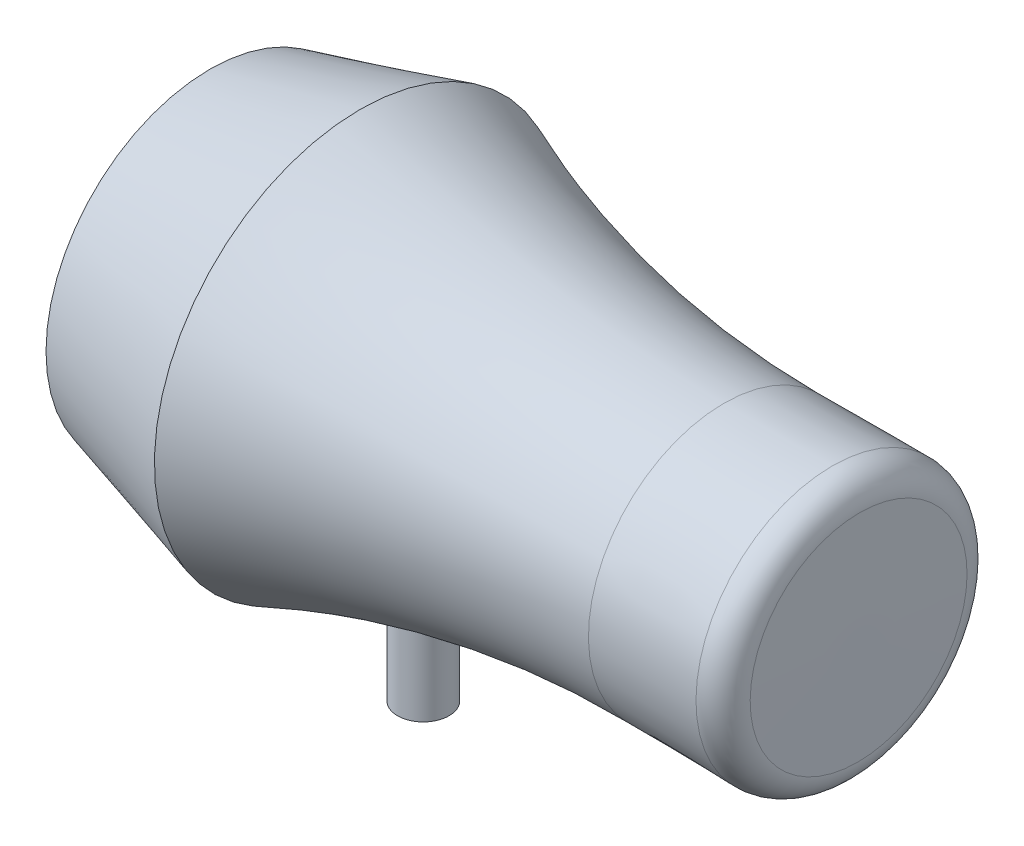
ISO-10303-21;
HEADER;
FILE_DESCRIPTION(('STEP AP214'),'2;1');
FILE_NAME('part.step','',(''),(''),'','','');
FILE_SCHEMA(('AUTOMOTIVE_DESIGN { 1 0 10303 214 1 1 1 1 }'));
ENDSEC;
DATA;
#1=APPLICATION_CONTEXT('core data for automotive mechanical design processes');
#2=APPLICATION_PROTOCOL_DEFINITION('international standard','automotive_design',2000,#1);
#3=PRODUCT_CONTEXT('',#1,'mechanical');
#4=PRODUCT('Part','Part','',(#3));
#5=PRODUCT_RELATED_PRODUCT_CATEGORY('part','',(#4));
#6=PRODUCT_DEFINITION_FORMATION('','',#4);
#7=PRODUCT_DEFINITION_CONTEXT('part definition',#1,'design');
#8=PRODUCT_DEFINITION('design','',#6,#7);
#9=PRODUCT_DEFINITION_SHAPE('','',#8);
#10=(LENGTH_UNIT() NAMED_UNIT(*) SI_UNIT(.MILLI.,.METRE.));
#11=(NAMED_UNIT(*) PLANE_ANGLE_UNIT() SI_UNIT($,.RADIAN.));
#12=(NAMED_UNIT(*) SI_UNIT($,.STERADIAN.) SOLID_ANGLE_UNIT());
#13=UNCERTAINTY_MEASURE_WITH_UNIT(LENGTH_MEASURE(1.E-05),#10,'distance_accuracy_value','');
#14=(GEOMETRIC_REPRESENTATION_CONTEXT(3) GLOBAL_UNCERTAINTY_ASSIGNED_CONTEXT((#13)) GLOBAL_UNIT_ASSIGNED_CONTEXT((#10,
#11,#12)) REPRESENTATION_CONTEXT('',''));
#15=CARTESIAN_POINT('',(0.,0.,0.));
#16=DIRECTION('',(0.,0.,1.));
#17=DIRECTION('',(1.,0.,0.));
#18=AXIS2_PLACEMENT_3D('',#15,#16,#17);
#19=CARTESIAN_POINT('',(18.4955377504804,-0.759996290132264,0.));
#20=DIRECTION('',(0.999967795768484,-0.00802542372205849,0.));
#21=DIRECTION('',(0.00802542372205849,0.999967795768484,0.));
#22=AXIS2_PLACEMENT_3D('',#19,#20,#21);
#23=TOROIDAL_SURFACE('',#22,202.989610337616,177.8);
#24=CARTESIAN_POINT('',(19.9224121353895,-0.771447930460593,0.));
#25=DIRECTION('',(0.999967795768484,-0.00802542372205849,0.));
#26=DIRECTION('',(0.00802542372205849,0.999967795768484,0.));
#27=AXIS2_PLACEMENT_3D('',#24,#25,#26);
#28=CIRCLE('',#27,25.1953362499792);
#29=CARTESIAN_POINT('',(20.1246153846154,24.4230769230769,0.));
#30=VERTEX_POINT('',#29);
#31=EDGE_CURVE('E95',#30,#30,#28,.T.);
#32=ORIENTED_EDGE('',*,*,#31,.F.);
#33=EDGE_LOOP('',(#32));
#34=FACE_BOUND('',#33,.T.);
#35=CARTESIAN_POINT('',(-48.3717211803845,-0.223340921505735,0.));
#36=DIRECTION('',(0.999967795768484,-0.00802542372205822,0.));
#37=DIRECTION('',(0.00802542372205822,0.999967795768484,0.));
#38=AXIS2_PLACEMENT_3D('',#35,#36,#37);
#39=CIRCLE('',#38,38.2433761345603);
#40=CARTESIAN_POINT('',(-48.0648018823426,38.0188036145156,0.));
#41=VERTEX_POINT('',#40);
#42=EDGE_CURVE('E58',#41,#41,#39,.T.);
#43=ORIENTED_EDGE('',*,*,#42,.T.);
#44=EDGE_LOOP('',(#43));
#45=FACE_BOUND('',#44,.T.);
#46=CARTESIAN_POINT('',(-40.016757228735,-35.1615698510924,-2.97514659516107));
#47=CARTESIAN_POINT('',(-40.1722349281604,-35.2311618020876,-2.77655082699506));
#48=CARTESIAN_POINT('',(-40.3131027765591,-35.2953994792489,-2.56447698170819));
#49=CARTESIAN_POINT('',(-40.4988743226301,-35.3810874967496,-2.22968443133164));
#50=CARTESIAN_POINT('',(-40.5565669343616,-35.407883456628,-2.11524152279435));
#51=CARTESIAN_POINT('',(-40.6629235025355,-35.457531849714,-1.88142918924304));
#52=CARTESIAN_POINT('',(-40.7115911027886,-35.4803858741999,-1.76206177637793));
#53=CARTESIAN_POINT('',(-40.7995639019031,-35.5218627495158,-1.51869735803328));
#54=CARTESIAN_POINT('',(-40.8388335348,-35.5404695149928,-1.39468475757077));
#55=CARTESIAN_POINT('',(-40.9073277718846,-35.5730193194119,-1.14336524801789));
#56=CARTESIAN_POINT('',(-40.9365564339832,-35.5869642423079,-1.01605969214673));
#57=CARTESIAN_POINT('',(-40.984639862774,-35.6099480012828,-0.759072690836843));
#58=CARTESIAN_POINT('',(-41.0034951952106,-35.6189871049166,-0.629391375366825));
#59=CARTESIAN_POINT('',(-41.0305994154213,-35.6319912809668,-0.368674224636947));
#60=CARTESIAN_POINT('',(-41.0388487881093,-35.6359565853619,-0.237638451580251));
#61=CARTESIAN_POINT('',(-41.0444909783644,-35.6386681037037,0.0180441213628814));
#62=CARTESIAN_POINT('',(-41.0424146870144,-35.6376695349499,0.142676863501199));
#63=CARTESIAN_POINT('',(-41.0286376064087,-35.6310514256732,0.391329160518251));
#64=CARTESIAN_POINT('',(-41.016933549015,-35.6254303160324,0.515348492792326));
#65=CARTESIAN_POINT('',(-40.9840366963564,-35.6096641465969,0.761774320191362));
#66=CARTESIAN_POINT('',(-40.9628479563307,-35.5995210202279,0.884181481609805));
#67=CARTESIAN_POINT('',(-40.9112086687856,-35.5748761547397,1.12662307054964));
#68=CARTESIAN_POINT('',(-40.8807546244686,-35.5603727700496,1.24665658399105));
#69=CARTESIAN_POINT('',(-40.811259046825,-35.527407326102,1.4823081172661));
#70=CARTESIAN_POINT('',(-40.7723077883319,-35.5089869297244,1.59795858269656));
#71=CARTESIAN_POINT('',(-40.6860257456762,-35.4683798442102,1.8254234915437));
#72=CARTESIAN_POINT('',(-40.6386919944756,-35.4461918216127,1.93723655990416));
#73=CARTESIAN_POINT('',(-40.4847547783901,-35.3744417972898,2.26589056805649));
#74=CARTESIAN_POINT('',(-40.3661608957373,-35.3196676820796,2.47612887139106));
#75=CARTESIAN_POINT('',(-40.0925476810907,-35.1952657628718,2.88696352537649));
#76=CARTESIAN_POINT('',(-39.9357012166353,-35.1249184541943,3.0861128957247));
#77=CARTESIAN_POINT('',(-39.5949196068184,-34.9751958095482,3.45580933532579));
#78=CARTESIAN_POINT('',(-39.410973715269,-34.8958168949826,3.62634500026276));
#79=CARTESIAN_POINT('',(-39.0029035234416,-34.7239892030125,3.94998079699878));
#80=CARTESIAN_POINT('',(-38.776651241138,-34.6310074404466,4.10011743942796));
#81=CARTESIAN_POINT('',(-38.3030688237537,-34.4424323734344,4.36019363725446));
#82=CARTESIAN_POINT('',(-38.0557309706292,-34.3468381215015,4.4701183951467));
#83=CARTESIAN_POINT('',(-37.5307938294396,-34.151232371844,4.6524854625074));
#84=CARTESIAN_POINT('',(-37.2522706785885,-34.0512897194598,4.72235806444642));
#85=CARTESIAN_POINT('',(-36.685410810729,-33.8567132500997,4.81176759937109));
#86=CARTESIAN_POINT('',(-36.3970740071176,-33.762079479993,4.8313040880364));
#87=CARTESIAN_POINT('',(-35.8208145060692,-33.5821724514794,4.81828011754186));
#88=CARTESIAN_POINT('',(-35.5329032639118,-33.4968378091177,4.78608659000642));
#89=CARTESIAN_POINT('',(-34.9645749348284,-33.3373717201809,4.66968536442058));
#90=CARTESIAN_POINT('',(-34.684155416223,-33.2632366011629,4.58549476304244));
#91=CARTESIAN_POINT('',(-34.1541722449159,-33.1311129356239,4.37182833948913));
#92=CARTESIAN_POINT('',(-33.903767020098,-33.0725029303172,4.24482398504983));
#93=CARTESIAN_POINT('',(-33.4270666332587,-32.9671848402192,3.94788454332894));
#94=CARTESIAN_POINT('',(-33.2007654825814,-32.9204737950997,3.77796015506455));
#95=CARTESIAN_POINT('',(-32.7892954110945,-32.8402240973269,3.40806881675776));
#96=CARTESIAN_POINT('',(-32.6027790939164,-32.8062066074049,3.20970200720758));
#97=CARTESIAN_POINT('',(-32.2652229383156,-32.7476467192565,2.78356615520435));
#98=CARTESIAN_POINT('',(-32.1141798086527,-32.7231034418664,2.55579984350951));
#99=CARTESIAN_POINT('',(-31.8545250358819,-32.682614585328,2.08129836580967));
#100=CARTESIAN_POINT('',(-31.7452782274813,-32.6665387797329,1.83492147395857));
#101=CARTESIAN_POINT('',(-31.5692029186733,-32.6413276362371,1.32711497955564));
#102=CARTESIAN_POINT('',(-31.5023739080979,-32.6321922148628,1.06568555808505));
#103=CARTESIAN_POINT('',(-31.4131987829437,-32.6201209274705,0.535492535037233));
#104=CARTESIAN_POINT('',(-31.390806329597,-32.617178603051,0.266736870214497));
#105=CARTESIAN_POINT('',(-31.3910303167473,-32.6172083406016,-0.270757326485159));
#106=CARTESIAN_POINT('',(-31.4136470196903,-32.6201804370585,-0.539495858253039));
#107=CARTESIAN_POINT('',(-31.5032554166711,-32.6323127080586,-1.06956698421881));
#108=CARTESIAN_POINT('',(-31.5702853353585,-32.641478213152,-1.33089299655111));
#109=CARTESIAN_POINT('',(-31.7467360254139,-32.6667519504533,-1.83845998422246));
#110=CARTESIAN_POINT('',(-31.8561560590514,-32.6828600618372,-2.08470122200097));
#111=CARTESIAN_POINT('',(-32.1139285116709,-32.7230731800902,-2.5549128812951));
#112=CARTESIAN_POINT('',(-32.2622499744547,-32.747171832418,-2.77890081655709));
#113=CARTESIAN_POINT('',(-32.5932289155147,-32.8045106045803,-3.19852424847324));
#114=CARTESIAN_POINT('',(-32.7758849883058,-32.8377503502504,-3.39416090510481));
#115=CARTESIAN_POINT('',(-33.1698632654611,-32.914317690955,-3.75187463165558));
#116=CARTESIAN_POINT('',(-33.3811992095854,-32.9576501282994,-3.91393552171952));
#117=CARTESIAN_POINT('',(-33.82582983364,-33.0548320868063,-4.20034787460031));
#118=CARTESIAN_POINT('',(-34.0591251913331,-33.1086819326369,-4.32469817300406));
#119=CARTESIAN_POINT('',(-34.5437919122309,-33.227446619494,-4.53448791320641));
#120=CARTESIAN_POINT('',(-34.7953618856362,-33.2924986671634,-4.61938973825939));
#121=CARTESIAN_POINT('',(-35.3064524130409,-33.4321448346848,-4.74665423408776));
#122=CARTESIAN_POINT('',(-35.5659741752312,-33.5067404100983,-4.78901040713723));
#123=CARTESIAN_POINT('',(-36.0958933663917,-33.6667216435033,-4.83207404634534));
#124=CARTESIAN_POINT('',(-36.3663316468957,-33.7524082468824,-4.83114958183053));
#125=CARTESIAN_POINT('',(-36.9014391918086,-33.9296588148882,-4.78475684517128));
#126=CARTESIAN_POINT('',(-37.1661060470983,-34.0212251732411,-4.73927032240091));
#127=CARTESIAN_POINT('',(-37.6967460196846,-34.2119566145768,-4.602098655424));
#128=CARTESIAN_POINT('',(-37.9620816794289,-34.3112699787761,-4.50815050280279));
#129=CARTESIAN_POINT('',(-38.4727049375475,-34.5089335532411,-4.27555581319963));
#130=CARTESIAN_POINT('',(-38.7179985073636,-34.6072840426471,-4.13692265121749));
#131=CARTESIAN_POINT('',(-39.150337968414,-34.7854631895078,-3.83984282357942));
#132=CARTESIAN_POINT('',(-39.3407610603835,-34.8659845128424,-3.68670495442108));
#133=CARTESIAN_POINT('',(-39.6977215209937,-35.0199092082259,-3.35174267353969));
#134=CARTESIAN_POINT('',(-39.8642663336673,-35.0933147962776,-3.16992723930628));
#135=CARTESIAN_POINT('',(-40.016757228735,-35.1615698510924,-2.97514659516107));
#136=B_SPLINE_CURVE_WITH_KNOTS('',3,(#46,#47,#48,#49,#50,#51,#52,#53,#54,#55,#56,#57,#58,#59,
#60,#61,#62,#63,#64,#65,#66,#67,#68,#69,#70,#71,#72,#73,#74,#75,#76,#77,#78,#79,#80,#81,#82,#83,
#84,#85,#86,#87,#88,#89,#90,#91,#92,#93,#94,#95,#96,#97,#98,#99,#100,#101,#102,#103,#104,#105,
#106,#107,#108,#109,#110,#111,#112,#113,#114,#115,#116,#117,#118,#119,#120,#121,#122,#123,#124,
#125,#126,#127,#128,#129,#130,#131,#132,#133,#134,#135),.UNSPECIFIED.,.T.,.F.,(4,2,2,2,2,2,2,2,
2,2,2,2,2,2,2,2,2,2,2,2,2,2,2,2,2,2,2,2,2,2,2,2,2,2,2,2,2,2,2,2,2,2,2,2,4),(0.,
0.784006316288985,1.17642572312711,1.56868634566547,1.96240877332601,2.35597189614295,
2.7495135525426,3.14303721522646,3.51654368470069,3.89017699301186,4.26365070427579,
4.63726554262972,5.00708923065152,5.37704408276729,6.11638347988712,6.90240556040194,
7.68874017855431,8.54605631676498,9.40368762072218,10.3115038867232,11.2193281660534,
12.1207414376301,13.0218584815989,13.877974543492,14.7338774048012,15.5530891962254,
16.3722249502499,17.1783649621938,17.9844952783358,18.7897845131912,19.5950784436596,
20.4010663597242,21.2070402495178,22.0123747133118,22.8176762179683,23.6233648920431,
24.4290784413296,25.2454718308518,26.0619898839777,26.909319327479,27.7569959443595,
28.6484181920823,29.5395738690224,30.3087593486597,31.0777045115448),.UNSPECIFIED.);
#137=CARTESIAN_POINT('',(-40.016757228735,-35.1615698510924,-2.97514659516107));
#138=VERTEX_POINT('',#137);
#139=EDGE_CURVE('E48',#138,#138,#136,.T.);
#140=ORIENTED_EDGE('',*,*,#139,.T.);
#141=EDGE_LOOP('',(#140));
#142=FACE_BOUND('',#141,.T.);
#143=ADVANCED_FACE('F43',(#34,#45,#142),#23,.F.);
#144=CARTESIAN_POINT('',(-76.5057587967662,0.00245392292749845,0.));
#145=DIRECTION('',(-0.999967795768484,0.00802542372205849,0.));
#146=DIRECTION('',(-0.00802542372205849,-0.999967795768484,0.));
#147=AXIS2_PLACEMENT_3D('',#144,#145,#146);
#148=CONICAL_SURFACE('',#147,38.0987730187792,1.56277081692086);
#149=CARTESIAN_POINT('',(-76.444607037413,0.00196313834199886,0.));
#150=DIRECTION('',(0.999967795768484,-0.00802542372205822,0.));
#151=DIRECTION('',(0.00802542372205822,0.999967795768484,0.));
#152=AXIS2_PLACEMENT_3D('',#149,#150,#151);
#153=CIRCLE('',#152,30.4790184150235);
#154=CARTESIAN_POINT('',(-76.2,30.4800000000001,0.));
#155=VERTEX_POINT('',#154);
#156=EDGE_CURVE('E11',#155,#155,#153,.F.);
#157=ORIENTED_EDGE('',*,*,#156,.T.);
#158=EDGE_LOOP('',(#157));
#159=FACE_BOUND('',#158,.T.);
#160=CARTESIAN_POINT('',(-76.2702559154235,-3.92755115071178,-2.8043950612096));
#161=CARTESIAN_POINT('',(-76.2696236236719,-3.84876211167393,-2.91474046346334));
#162=CARTESIAN_POINT('',(-76.2689548756908,-3.76532804861974,-3.02174934938393));
#163=CARTESIAN_POINT('',(-76.2675460315519,-3.58971981560382,-3.22840064177692));
#164=CARTESIAN_POINT('',(-76.2668059153626,-3.49754319192304,-3.32804096611389));
#165=CARTESIAN_POINT('',(-76.2652606191127,-3.30504353517902,-3.51928828252165));
#166=CARTESIAN_POINT('',(-76.264455382168,-3.20471337949118,-3.61088810222305));
#167=CARTESIAN_POINT('',(-76.2627854218745,-2.9966521417144,-3.78533861646541));
#168=CARTESIAN_POINT('',(-76.2619206768652,-2.88891836480298,-3.86818609712982));
#169=CARTESIAN_POINT('',(-76.2601389848777,-2.66694373230538,-4.02443706443614));
#170=CARTESIAN_POINT('',(-76.2592220824926,-2.55270843530835,-4.09784844870556));
#171=CARTESIAN_POINT('',(-76.2573415545802,-2.31841692154855,-4.23481269646279));
#172=CARTESIAN_POINT('',(-76.2563779119509,-2.19835857416984,-4.29836191518295));
#173=CARTESIAN_POINT('',(-76.2544116888035,-1.95338985657803,-4.41508108828791));
#174=CARTESIAN_POINT('',(-76.2534091327076,-1.82848252960935,-4.46825743039989));
#175=CARTESIAN_POINT('',(-76.2513712677975,-1.5745866513496,-4.56391972420132));
#176=CARTESIAN_POINT('',(-76.2503359470318,-1.44559661080929,-4.60640172312965));
#177=CARTESIAN_POINT('',(-76.2482405130595,-1.18452694601343,-4.68033904405472));
#178=CARTESIAN_POINT('',(-76.2471804057178,-1.05244805263075,-4.71179694692839));
#179=CARTESIAN_POINT('',(-76.2450423044701,-0.786061063109786,-4.76348606911155));
#180=CARTESIAN_POINT('',(-76.243964304104,-0.651752161829699,-4.78371313858901));
#181=CARTESIAN_POINT('',(-76.2417988164756,-0.381951644578444,-4.8127737416851));
#182=CARTESIAN_POINT('',(-76.2407113324568,-0.246460432957635,-4.82161102784992));
#183=CARTESIAN_POINT('',(-76.2385338777188,0.0248325505820193,-4.82784414260683));
#184=CARTESIAN_POINT('',(-76.2374439062298,0.160634418695916,-4.82523574554641));
#185=CARTESIAN_POINT('',(-76.2352699389298,0.431494367299995,-4.80858423983496));
#186=CARTESIAN_POINT('',(-76.234185941054,0.566552704795873,-4.79454536941742));
#187=CARTESIAN_POINT('',(-76.2320311697449,0.83502242674207,-4.75515049875146));
#188=CARTESIAN_POINT('',(-76.230960401342,0.968433184724771,-4.72979032211333));
#189=CARTESIAN_POINT('',(-76.2277802829127,1.36465624222601,-4.63695910915669));
#190=CARTESIAN_POINT('',(-76.2257007522266,1.62375429050619,-4.55271898860184));
#191=CARTESIAN_POINT('',(-76.221685889534,2.12398646814511,-4.3419728669764));
#192=CARTESIAN_POINT('',(-76.2197505573601,2.3651206183531,-4.21546691496128));
#193=CARTESIAN_POINT('',(-76.2160775319426,2.82276595098677,-3.92375521886948));
#194=CARTESIAN_POINT('',(-76.2143398383257,3.03927717990048,-3.7585495478596));
#195=CARTESIAN_POINT('',(-76.211111850846,3.44147590646286,-3.3941382988799));
#196=CARTESIAN_POINT('',(-76.2096215516482,3.62716406879867,-3.19493345427666));
#197=CARTESIAN_POINT('',(-76.2069305042449,3.96246395934432,-2.76817399020365));
#198=CARTESIAN_POINT('',(-76.2057297562964,4.11207565553503,-2.54061934557273));
#199=CARTESIAN_POINT('',(-76.2036519624725,4.37096674536404,-2.06362821776608));
#200=CARTESIAN_POINT('',(-76.2027749064008,4.48024740941962,-1.81419242414738));
#201=CARTESIAN_POINT('',(-76.2013693335307,4.65538118480242,-1.30051369175396));
#202=CARTESIAN_POINT('',(-76.2008408165347,4.72123432075312,-1.036270761375));
#203=CARTESIAN_POINT('',(-76.2001473363509,4.80764188028457,-0.500486325916587));
#204=CARTESIAN_POINT('',(-76.1999823634862,4.82819750960775,-0.228945015302335));
#205=CARTESIAN_POINT('',(-76.2000206255256,4.82343005952682,0.313734559006065));
#206=CARTESIAN_POINT('',(-76.2002238604453,4.79810697818776,0.584872822683215));
#207=CARTESIAN_POINT('',(-76.2009927647526,4.70230159882918,1.11904644469738));
#208=CARTESIAN_POINT('',(-76.2015584302798,4.6318197818276,1.38208188931203));
#209=CARTESIAN_POINT('',(-76.2030361347385,4.44769851045009,1.89258627405885));
#210=CARTESIAN_POINT('',(-76.2039481736631,4.33405905695659,2.14005521450931));
#211=CARTESIAN_POINT('',(-76.2060927470161,4.06684744917767,2.61240455651441));
#212=CARTESIAN_POINT('',(-76.207325284709,3.91327488815547,2.83728472795987));
#213=CARTESIAN_POINT('',(-76.2100758655254,3.57055747848731,3.25807064379573));
#214=CARTESIAN_POINT('',(-76.211593908698,3.3814126237267,3.45397638320561));
#215=CARTESIAN_POINT('',(-76.2148724559757,2.97291462403656,3.81125790265104));
#216=CARTESIAN_POINT('',(-76.2166329665195,2.75356067691324,3.97263276543834));
#217=CARTESIAN_POINT('',(-76.2203464471965,2.29087521286369,4.25626573642268));
#218=CARTESIAN_POINT('',(-76.222299417338,2.04754369491178,4.37852384294641));
#219=CARTESIAN_POINT('',(-76.2263424468378,1.54380259487337,4.58045689299385));
#220=CARTESIAN_POINT('',(-76.2284325104566,1.28339248202834,4.6601305123972));
#221=CARTESIAN_POINT('',(-76.2326903531931,0.752892240525543,4.77462695818422));
#222=CARTESIAN_POINT('',(-76.2348581323533,0.482802106552107,4.80944975993823));
#223=CARTESIAN_POINT('',(-76.2392099005789,-0.0593948204814437,4.83325889844149));
#224=CARTESIAN_POINT('',(-76.2413938900092,-0.331501658945617,4.82224420005747));
#225=CARTESIAN_POINT('',(-76.245716111999,-0.87001151222567,4.75467963275733));
#226=CARTESIAN_POINT('',(-76.2478543446046,-1.1364145327738,4.69812980960551));
#227=CARTESIAN_POINT('',(-76.2520240589007,-1.65591778949817,4.54113337542673));
#228=CARTESIAN_POINT('',(-76.2540555402544,-1.90901798370284,4.44068662591048));
#229=CARTESIAN_POINT('',(-76.2579552013605,-2.39487050524164,4.19862167246329));
#230=CARTESIAN_POINT('',(-76.2598233808283,-2.62762279712024,4.05700339679423));
#231=CARTESIAN_POINT('',(-76.2624611600898,-2.95625643895721,3.81697876118785));
#232=CARTESIAN_POINT('',(-76.2633134106758,-3.06243574665465,3.73231909396099));
#233=CARTESIAN_POINT('',(-76.2649575923703,-3.2672789367994,3.5543684971148));
#234=CARTESIAN_POINT('',(-76.2657495456273,-3.36594557879291,3.46108076490759));
#235=CARTESIAN_POINT('',(-76.2672677842849,-3.55509719438866,3.26649464840009));
#236=CARTESIAN_POINT('',(-76.2679940452054,-3.64557911798881,3.16519330400437));
#237=CARTESIAN_POINT('',(-76.2693752393995,-3.81765625906764,2.95536399999615));
#238=CARTESIAN_POINT('',(-76.2700301989016,-3.89925474437903,2.84683872159123));
#239=CARTESIAN_POINT('',(-76.2712646381263,-4.05304780292885,2.62326074726243));
#240=CARTESIAN_POINT('',(-76.2718440907291,-4.12523899735775,2.50820572723859));
#241=CARTESIAN_POINT('',(-76.2729229250424,-4.25964557356685,2.27246522305556));
#242=CARTESIAN_POINT('',(-76.2734223362308,-4.32186462792245,2.15178183296983));
#243=CARTESIAN_POINT('',(-76.2743379449254,-4.43593545606752,1.9055623342049));
#244=CARTESIAN_POINT('',(-76.2747541149309,-4.48778380365883,1.7800246380873));
#245=CARTESIAN_POINT('',(-76.2754999366621,-4.58070158261349,1.52507396883357));
#246=CARTESIAN_POINT('',(-76.2758296202697,-4.62177498600555,1.39566244338434));
#247=CARTESIAN_POINT('',(-76.2764003939717,-4.69288438771655,1.13380879632809));
#248=CARTESIAN_POINT('',(-76.2766414632533,-4.72291779310335,1.00136597051747));
#249=CARTESIAN_POINT('',(-76.2770331124599,-4.77171105135901,0.73447017047579));
#250=CARTESIAN_POINT('',(-76.2771837257392,-4.79047505966247,0.60001795594495));
#251=CARTESIAN_POINT('',(-76.2773935963972,-4.81662157564432,0.329927336433475));
#252=CARTESIAN_POINT('',(-76.2774527972829,-4.82399704520448,0.194288249989496));
#253=CARTESIAN_POINT('',(-76.2774792387919,-4.82729126027256,-0.0770788349061266));
#254=CARTESIAN_POINT('',(-76.2774465133001,-4.82321422728535,-0.212806782163353));
#255=CARTESIAN_POINT('',(-76.2772893432119,-4.80363325127387,-0.483549187715539));
#256=CARTESIAN_POINT('',(-76.2771648226434,-4.78811984320045,-0.618562961665934));
#257=CARTESIAN_POINT('',(-76.276824920883,-4.74577388825257,-0.886752393781501));
#258=CARTESIAN_POINT('',(-76.2766095728288,-4.71894546958203,-1.01992870405054));
#259=CARTESIAN_POINT('',(-76.2760897987596,-4.6541884170836,-1.28343083376467));
#260=CARTESIAN_POINT('',(-76.2757854523124,-4.61626969837778,-1.4137590880988));
#261=CARTESIAN_POINT('',(-76.2750898129183,-4.52960921712855,-1.67071864106204));
#262=CARTESIAN_POINT('',(-76.2746985428721,-4.48087030523638,-1.7973509035005));
#263=CARTESIAN_POINT('',(-76.2737241729497,-4.35945650930449,-2.07703404230487));
#264=CARTESIAN_POINT('',(-76.2731175659991,-4.28384336509043,-2.2288190503594));
#265=CARTESIAN_POINT('',(-76.2717782278114,-4.11708501734939,-2.52360204978683));
#266=CARTESIAN_POINT('',(-76.2710454966061,-4.02593981773272,-2.66660004337192));
#267=CARTESIAN_POINT('',(-76.2702559154235,-3.92755115071178,-2.8043950612096));
#268=B_SPLINE_CURVE_WITH_KNOTS('',3,(#160,#161,#162,#163,#164,#165,#166,#167,#168,#169,#170,
#171,#172,#173,#174,#175,#176,#177,#178,#179,#180,#181,#182,#183,#184,#185,#186,#187,#188,#189,
#190,#191,#192,#193,#194,#195,#196,#197,#198,#199,#200,#201,#202,#203,#204,#205,#206,#207,#208,
#209,#210,#211,#212,#213,#214,#215,#216,#217,#218,#219,#220,#221,#222,#223,#224,#225,#226,#227,
#228,#229,#230,#231,#232,#233,#234,#235,#236,#237,#238,#239,#240,#241,#242,#243,#244,#245,#246,
#247,#248,#249,#250,#251,#252,#253,#254,#255,#256,#257,#258,#259,#260,#261,#262,#263,#264,#265,
#266,#267),.UNSPECIFIED.,.T.,.F.,(4,2,2,2,2,2,2,2,2,2,2,2,2,2,2,2,2,2,2,2,2,2,2,2,2,2,2,2,2,2,2,
2,2,2,2,2,2,2,2,2,2,2,2,2,2,2,2,2,2,2,2,2,2,4),(0.,0.406617445760708,0.813349353885805,
1.22044046814446,1.62768055126416,2.03457754038204,2.44162455042927,2.84842009975844,
3.25536578570678,3.66221613690186,4.06921672084285,4.47608317762774,4.88309985881224,
5.28996569352438,5.69698174378614,6.51013837625682,7.32329406494772,8.13644821837697,
8.94958483418242,9.76272217167227,10.5758338933556,11.3889451540032,12.2020347707537,
13.0151244217965,13.8282054121847,14.6412863859484,15.4543756416345,16.2674650370855,
17.0805760280574,17.8936870538121,18.7068233609382,19.5199601145949,20.3331152311525,
21.1462695304634,21.9594263951926,22.7725846767921,23.1795931590719,23.5864514107961,
23.9934606573299,24.4003196732312,24.8073244199496,25.2141789273559,25.6211676271681,
26.0280060849327,26.4349400346999,26.8417238409179,27.2487589391015,27.6556440198428,
28.0628662281288,28.4699399925374,28.876650925258,29.2832548341921,29.7910229074716,
30.2987908529168),.UNSPECIFIED.);
#269=CARTESIAN_POINT('',(-76.2702559154235,-3.92755115071178,-2.8043950612096));
#270=VERTEX_POINT('',#269);
#271=EDGE_CURVE('E89',#270,#270,#268,.T.);
#272=ORIENTED_EDGE('',*,*,#271,.T.);
#273=EDGE_LOOP('',(#272));
#274=FACE_BOUND('',#273,.T.);
#275=ADVANCED_FACE('F73',(#159,#274),#148,.F.);
#276=CARTESIAN_POINT('',(45.3207761867712,-0.975287128304748,0.));
#277=DIRECTION('',(0.999967795768484,-0.00802542372205849,0.));
#278=DIRECTION('',(0.00802542372205849,0.999967795768484,0.));
#279=AXIS2_PLACEMENT_3D('',#276,#277,#278);
#280=CONICAL_SURFACE('',#279,25.3991820125195,0.00802550987403543);
#281=CARTESIAN_POINT('',(40.2411033764949,-0.934519288735919,0.));
#282=DIRECTION('',(-0.999967795768484,0.00802542372205849,0.));
#283=DIRECTION('',(-0.00802542372205849,-0.999967795768484,0.));
#284=AXIS2_PLACEMENT_3D('',#281,#282,#283);
#285=CIRCLE('',#284,25.3584128600115);
#286=CARTESIAN_POINT('',(40.0375913683744,-26.2921155005488,0.));
#287=VERTEX_POINT('',#286);
#288=EDGE_CURVE('E134',#287,#287,#285,.T.);
#289=ORIENTED_EDGE('',*,*,#288,.T.);
#290=EDGE_LOOP('',(#289));
#291=FACE_BOUND('',#290,.T.);
#292=ORIENTED_EDGE('',*,*,#31,.T.);
#293=EDGE_LOOP('',(#292));
#294=FACE_BOUND('',#293,.T.);
#295=ADVANCED_FACE('F65',(#291,#294),#280,.T.);
#296=CARTESIAN_POINT('',(45.5246153846154,-0.97692307692308,0.));
#297=DIRECTION('',(-0.999967795768484,0.00802542372205849,0.));
#298=DIRECTION('',(-0.00802542372205849,-0.999967795768484,0.));
#299=AXIS2_PLACEMENT_3D('',#296,#297,#298);
#300=CONICAL_SURFACE('',#299,0.,1.56277081692086);
#301=CARTESIAN_POINT('',(45.36154402634,-0.975614318028415,0.));
#302=DIRECTION('',(0.999967795768484,-0.00802542372205849,0.));
#303=DIRECTION('',(0.00802542372205849,0.999967795768484,0.));
#304=AXIS2_PLACEMENT_3D('',#301,#302,#303);
#305=CIRCLE('',#304,20.3193456100156);
#306=CARTESIAN_POINT('',(45.5246153846154,19.3430769230769,0.));
#307=VERTEX_POINT('',#306);
#308=EDGE_CURVE('E131',#307,#307,#305,.T.);
#309=ORIENTED_EDGE('',*,*,#308,.T.);
#310=EDGE_LOOP('',(#309));
#311=FACE_BOUND('',#310,.T.);
#312=CARTESIAN_POINT('',(45.5246153846154,-0.97692307692308,0.));
#313=VERTEX_POINT('',#312);
#314=VERTEX_LOOP('',#313);
#315=FACE_BOUND('',#314,.T.);
#316=ADVANCED_FACE('F62',(#311,#315),#300,.T.);
#317=CARTESIAN_POINT('',(40.2818712160637,-0.934846478459583,0.));
#318=DIRECTION('',(-0.999967795768484,0.00802542372205849,0.));
#319=DIRECTION('',(-0.00802542372205849,-0.999967795768484,0.));
#320=AXIS2_PLACEMENT_3D('',#317,#318,#319);
#321=TOROIDAL_SURFACE('',#320,20.2785764575075,5.08);
#322=ORIENTED_EDGE('',*,*,#288,.F.);
#323=EDGE_LOOP('',(#322));
#324=FACE_BOUND('',#323,.T.);
#325=ORIENTED_EDGE('',*,*,#308,.F.);
#326=EDGE_LOOP('',(#325));
#327=FACE_BOUND('',#326,.T.);
#328=ADVANCED_FACE('F64',(#324,#327),#321,.T.);
#329=CARTESIAN_POINT('',(-48.0693632760989,-0.225767549951045,0.));
#330=DIRECTION('',(0.999967795768484,-0.00802542372205822,0.));
#331=DIRECTION('',(0.00802542372205822,0.999967795768484,0.));
#332=AXIS2_PLACEMENT_3D('',#329,#330,#331);
#333=CONICAL_SURFACE('',#332,38.3270018415916,0.269824897673171);
#334=ORIENTED_EDGE('',*,*,#156,.F.);
#335=EDGE_LOOP('',(#334));
#336=FACE_BOUND('',#335,.T.);
#337=ORIENTED_EDGE('',*,*,#42,.F.);
#338=EDGE_LOOP('',(#337));
#339=FACE_BOUND('',#338,.T.);
#340=ADVANCED_FACE('F46',(#336,#339),#333,.T.);
#341=CARTESIAN_POINT('',(-63.5,0.,0.));
#342=DIRECTION('',(-1.,0.,0.));
#343=DIRECTION('',(0.,0.,1.));
#344=AXIS2_PLACEMENT_3D('',#341,#342,#343);
#345=CYLINDRICAL_SURFACE('',#344,4.826);
#346=ORIENTED_EDGE('',*,*,#271,.F.);
#347=EDGE_LOOP('',(#346));
#348=FACE_BOUND('',#347,.T.);
#349=CARTESIAN_POINT('',(-88.9,0.,0.));
#350=DIRECTION('',(1.,0.,0.));
#351=DIRECTION('',(0.,0.,-1.));
#352=AXIS2_PLACEMENT_3D('',#349,#350,#351);
#353=CIRCLE('',#352,4.826);
#354=CARTESIAN_POINT('',(-88.9,0.,-4.826));
#355=VERTEX_POINT('',#354);
#356=EDGE_CURVE('E96',#355,#355,#353,.T.);
#357=ORIENTED_EDGE('',*,*,#356,.T.);
#358=EDGE_LOOP('',(#357));
#359=FACE_BOUND('',#358,.T.);
#360=ADVANCED_FACE('F98',(#348,#359),#345,.T.);
#361=CARTESIAN_POINT('',(-88.9,0.,0.));
#362=DIRECTION('',(1.,0.,0.));
#363=DIRECTION('',(0.,0.,-1.));
#364=AXIS2_PLACEMENT_3D('',#361,#362,#363);
#365=PLANE('',#364);
#366=ORIENTED_EDGE('',*,*,#356,.F.);
#367=EDGE_LOOP('',(#366));
#368=FACE_BOUND('',#367,.T.);
#369=ADVANCED_FACE('F102',(#368),#365,.F.);
#370=CARTESIAN_POINT('',(-36.2169179045004,-26.67,0.));
#371=DIRECTION('',(0.,-1.,0.));
#372=DIRECTION('',(0.,0.,-1.));
#373=AXIS2_PLACEMENT_3D('',#370,#371,#372);
#374=CYLINDRICAL_SURFACE('',#373,4.826);
#375=ORIENTED_EDGE('',*,*,#139,.F.);
#376=EDGE_LOOP('',(#375));
#377=FACE_BOUND('',#376,.T.);
#378=CARTESIAN_POINT('',(-36.2169179045004,-52.07,0.));
#379=DIRECTION('',(0.,1.,0.));
#380=DIRECTION('',(0.,0.,1.));
#381=AXIS2_PLACEMENT_3D('',#378,#379,#380);
#382=CIRCLE('',#381,4.826);
#383=CARTESIAN_POINT('',(-36.2169179045004,-52.07,4.826));
#384=VERTEX_POINT('',#383);
#385=EDGE_CURVE('E118',#384,#384,#382,.T.);
#386=ORIENTED_EDGE('',*,*,#385,.T.);
#387=EDGE_LOOP('',(#386));
#388=FACE_BOUND('',#387,.T.);
#389=ADVANCED_FACE('F105',(#377,#388),#374,.T.);
#390=CARTESIAN_POINT('',(-36.2169179045004,-52.07,0.));
#391=DIRECTION('',(0.,1.,0.));
#392=DIRECTION('',(0.,0.,1.));
#393=AXIS2_PLACEMENT_3D('',#390,#391,#392);
#394=PLANE('',#393);
#395=ORIENTED_EDGE('',*,*,#385,.F.);
#396=EDGE_LOOP('',(#395));
#397=FACE_BOUND('',#396,.T.);
#398=ADVANCED_FACE('F110',(#397),#394,.F.);
#399=CLOSED_SHELL('',(#143,#275,#295,#316,#328,#340,#360,#369,#389,#398));
#400=MANIFOLD_SOLID_BREP('B2',#399);
#401=ADVANCED_BREP_SHAPE_REPRESENTATION('',(#18,#400),#14);
#402=SHAPE_DEFINITION_REPRESENTATION(#9,#401);
ENDSEC;
END-ISO-10303-21;
